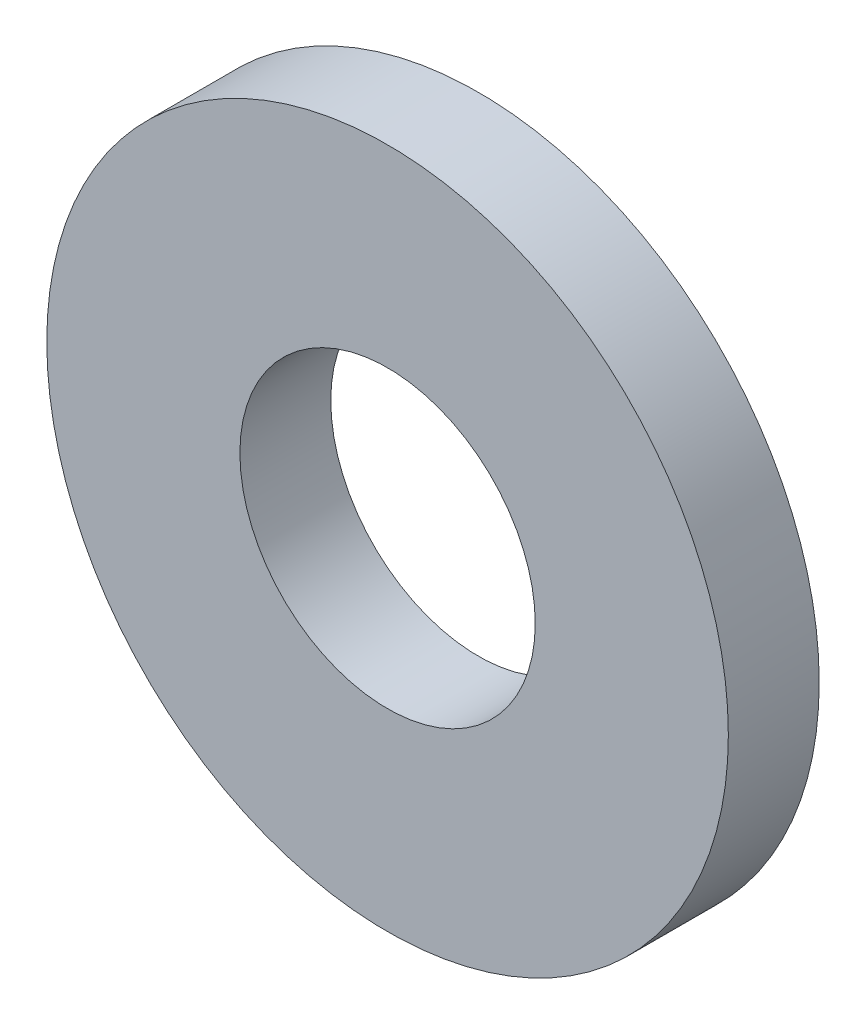
ISO-10303-21;
HEADER;
FILE_DESCRIPTION(('STEP AP214'),'2;1');
FILE_NAME('part.step','',(''),(''),'','','');
FILE_SCHEMA(('AUTOMOTIVE_DESIGN { 1 0 10303 214 1 1 1 1 }'));
ENDSEC;
DATA;
#1=APPLICATION_CONTEXT('core data for automotive mechanical design processes');
#2=APPLICATION_PROTOCOL_DEFINITION('international standard','automotive_design',2000,#1);
#3=PRODUCT_CONTEXT('',#1,'mechanical');
#4=PRODUCT('Part','Part','',(#3));
#5=PRODUCT_RELATED_PRODUCT_CATEGORY('part','',(#4));
#6=PRODUCT_DEFINITION_FORMATION('','',#4);
#7=PRODUCT_DEFINITION_CONTEXT('part definition',#1,'design');
#8=PRODUCT_DEFINITION('design','',#6,#7);
#9=PRODUCT_DEFINITION_SHAPE('','',#8);
#10=(LENGTH_UNIT() NAMED_UNIT(*) SI_UNIT(.MILLI.,.METRE.));
#11=(NAMED_UNIT(*) PLANE_ANGLE_UNIT() SI_UNIT($,.RADIAN.));
#12=(NAMED_UNIT(*) SI_UNIT($,.STERADIAN.) SOLID_ANGLE_UNIT());
#13=UNCERTAINTY_MEASURE_WITH_UNIT(LENGTH_MEASURE(1.E-05),#10,'distance_accuracy_value','');
#14=(GEOMETRIC_REPRESENTATION_CONTEXT(3) GLOBAL_UNCERTAINTY_ASSIGNED_CONTEXT((#13)) GLOBAL_UNIT_ASSIGNED_CONTEXT((#10,
#11,#12)) REPRESENTATION_CONTEXT('',''));
#15=CARTESIAN_POINT('',(0.,0.,0.));
#16=DIRECTION('',(0.,0.,1.));
#17=DIRECTION('',(1.,0.,0.));
#18=AXIS2_PLACEMENT_3D('',#15,#16,#17);
#19=CARTESIAN_POINT('',(0.,0.,2.));
#20=DIRECTION('',(0.,0.,1.));
#21=DIRECTION('',(1.,0.,0.));
#22=AXIS2_PLACEMENT_3D('',#19,#20,#21);
#23=PLANE('',#22);
#24=CARTESIAN_POINT('',(0.,0.,2.));
#25=DIRECTION('',(0.,0.,1.));
#26=DIRECTION('',(1.,0.,0.));
#27=AXIS2_PLACEMENT_3D('',#24,#25,#26);
#28=CIRCLE('',#27,7.5);
#29=CARTESIAN_POINT('',(7.5,0.,2.));
#30=VERTEX_POINT('',#29);
#31=EDGE_CURVE('E10',#30,#30,#28,.T.);
#32=ORIENTED_EDGE('',*,*,#31,.T.);
#33=EDGE_LOOP('',(#32));
#34=FACE_BOUND('',#33,.T.);
#35=CARTESIAN_POINT('',(0.,0.,2.));
#36=DIRECTION('',(0.,0.,1.));
#37=DIRECTION('',(1.,0.,0.));
#38=AXIS2_PLACEMENT_3D('',#35,#36,#37);
#39=CIRCLE('',#38,3.25);
#40=CARTESIAN_POINT('',(3.25,0.,2.));
#41=VERTEX_POINT('',#40);
#42=EDGE_CURVE('E50',#41,#41,#39,.T.);
#43=ORIENTED_EDGE('',*,*,#42,.F.);
#44=EDGE_LOOP('',(#43));
#45=FACE_BOUND('',#44,.T.);
#46=ADVANCED_FACE('F37',(#34,#45),#23,.T.);
#47=CARTESIAN_POINT('',(0.,0.,0.));
#48=DIRECTION('',(0.,0.,1.));
#49=DIRECTION('',(1.,0.,0.));
#50=AXIS2_PLACEMENT_3D('',#47,#48,#49);
#51=PLANE('',#50);
#52=CARTESIAN_POINT('',(0.,0.,0.));
#53=DIRECTION('',(0.,0.,1.));
#54=DIRECTION('',(1.,0.,0.));
#55=AXIS2_PLACEMENT_3D('',#52,#53,#54);
#56=CIRCLE('',#55,7.5);
#57=CARTESIAN_POINT('',(7.5,0.,0.));
#58=VERTEX_POINT('',#57);
#59=EDGE_CURVE('E41',#58,#58,#56,.T.);
#60=ORIENTED_EDGE('',*,*,#59,.F.);
#61=EDGE_LOOP('',(#60));
#62=FACE_BOUND('',#61,.T.);
#63=CARTESIAN_POINT('',(0.,0.,0.));
#64=DIRECTION('',(0.,0.,1.));
#65=DIRECTION('',(1.,0.,0.));
#66=AXIS2_PLACEMENT_3D('',#63,#64,#65);
#67=CIRCLE('',#66,3.25);
#68=CARTESIAN_POINT('',(3.25,0.,0.));
#69=VERTEX_POINT('',#68);
#70=EDGE_CURVE('E52',#69,#69,#67,.T.);
#71=ORIENTED_EDGE('',*,*,#70,.T.);
#72=EDGE_LOOP('',(#71));
#73=FACE_BOUND('',#72,.T.);
#74=ADVANCED_FACE('F64',(#62,#73),#51,.F.);
#75=CARTESIAN_POINT('',(0.,0.,2.));
#76=DIRECTION('',(0.,0.,-1.));
#77=DIRECTION('',(-1.,0.,0.));
#78=AXIS2_PLACEMENT_3D('',#75,#76,#77);
#79=CYLINDRICAL_SURFACE('',#78,7.5);
#80=ORIENTED_EDGE('',*,*,#31,.F.);
#81=EDGE_LOOP('',(#80));
#82=FACE_BOUND('',#81,.T.);
#83=ORIENTED_EDGE('',*,*,#59,.T.);
#84=EDGE_LOOP('',(#83));
#85=FACE_BOUND('',#84,.T.);
#86=ADVANCED_FACE('F39',(#82,#85),#79,.T.);
#87=CARTESIAN_POINT('',(0.,0.,2.));
#88=DIRECTION('',(0.,0.,-1.));
#89=DIRECTION('',(-1.,0.,0.));
#90=AXIS2_PLACEMENT_3D('',#87,#88,#89);
#91=CYLINDRICAL_SURFACE('',#90,3.25);
#92=ORIENTED_EDGE('',*,*,#42,.T.);
#93=EDGE_LOOP('',(#92));
#94=FACE_BOUND('',#93,.T.);
#95=ORIENTED_EDGE('',*,*,#70,.F.);
#96=EDGE_LOOP('',(#95));
#97=FACE_BOUND('',#96,.T.);
#98=ADVANCED_FACE('F60',(#94,#97),#91,.F.);
#99=CLOSED_SHELL('',(#46,#74,#86,#98));
#100=MANIFOLD_SOLID_BREP('B2',#99);
#101=ADVANCED_BREP_SHAPE_REPRESENTATION('',(#18,#100),#14);
#102=SHAPE_DEFINITION_REPRESENTATION(#9,#101);
ENDSEC;
END-ISO-10303-21;
